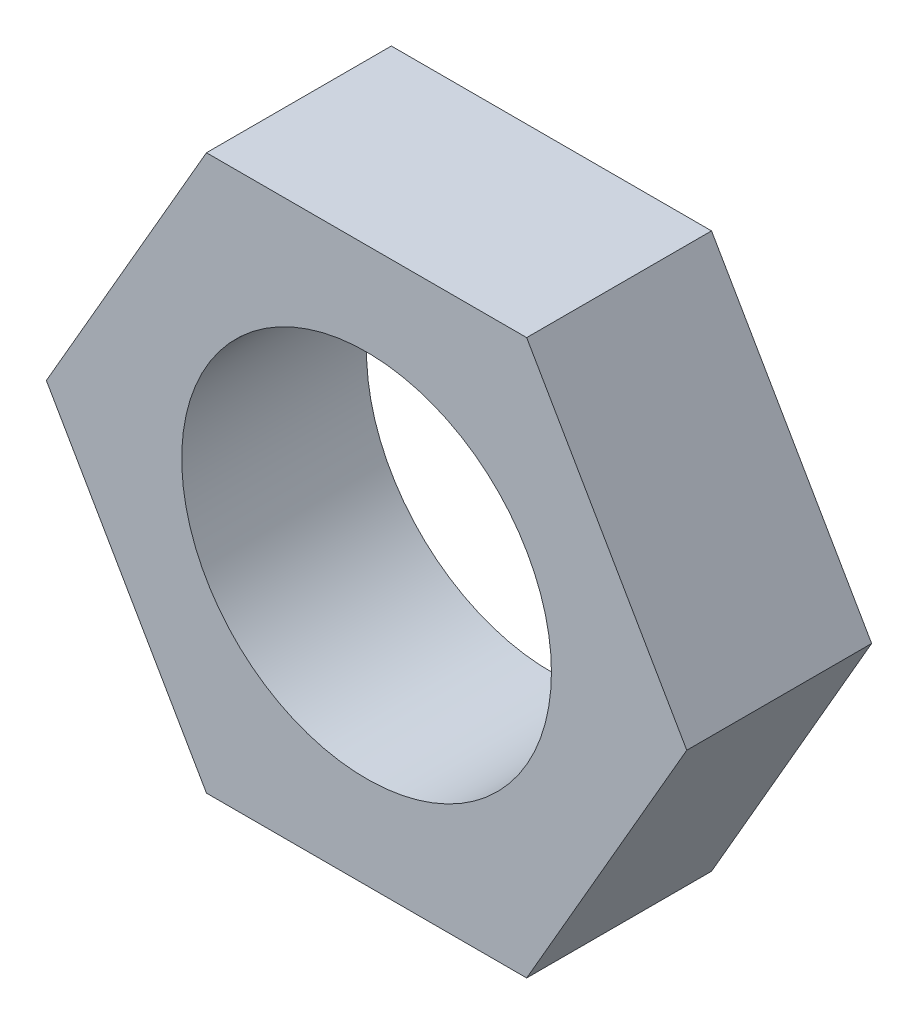
ISO-10303-21;
HEADER;
FILE_DESCRIPTION(('STEP AP214'),'2;1');
FILE_NAME('part.step','',(''),(''),'','','');
FILE_SCHEMA(('AUTOMOTIVE_DESIGN { 1 0 10303 214 1 1 1 1 }'));
ENDSEC;
DATA;
#1=APPLICATION_CONTEXT('core data for automotive mechanical design processes');
#2=APPLICATION_PROTOCOL_DEFINITION('international standard','automotive_design',2000,#1);
#3=PRODUCT_CONTEXT('',#1,'mechanical');
#4=PRODUCT('Part','Part','',(#3));
#5=PRODUCT_RELATED_PRODUCT_CATEGORY('part','',(#4));
#6=PRODUCT_DEFINITION_FORMATION('','',#4);
#7=PRODUCT_DEFINITION_CONTEXT('part definition',#1,'design');
#8=PRODUCT_DEFINITION('design','',#6,#7);
#9=PRODUCT_DEFINITION_SHAPE('','',#8);
#10=(LENGTH_UNIT() NAMED_UNIT(*) SI_UNIT(.MILLI.,.METRE.));
#11=(NAMED_UNIT(*) PLANE_ANGLE_UNIT() SI_UNIT($,.RADIAN.));
#12=(NAMED_UNIT(*) SI_UNIT($,.STERADIAN.) SOLID_ANGLE_UNIT());
#13=UNCERTAINTY_MEASURE_WITH_UNIT(LENGTH_MEASURE(1.E-05),#10,'distance_accuracy_value','');
#14=(GEOMETRIC_REPRESENTATION_CONTEXT(3) GLOBAL_UNCERTAINTY_ASSIGNED_CONTEXT((#13)) GLOBAL_UNIT_ASSIGNED_CONTEXT((#10,
#11,#12)) REPRESENTATION_CONTEXT('',''));
#15=CARTESIAN_POINT('',(0.,0.,0.));
#16=DIRECTION('',(0.,0.,1.));
#17=DIRECTION('',(1.,0.,0.));
#18=AXIS2_PLACEMENT_3D('',#15,#16,#17);
#19=CARTESIAN_POINT('',(0.,0.,2.));
#20=DIRECTION('',(0.,0.,1.));
#21=DIRECTION('',(1.,0.,0.));
#22=AXIS2_PLACEMENT_3D('',#19,#20,#21);
#23=PLANE('',#22);
#24=DIRECTION('',(0.5,0.866025403784438,0.));
#25=VECTOR('',#24,1.);
#26=CARTESIAN_POINT('',(1.73205080756888,-3.,2.));
#27=LINE('',#26,#25);
#28=CARTESIAN_POINT('',(1.73205080756888,-3.,2.));
#29=VERTEX_POINT('',#28);
#30=CARTESIAN_POINT('',(3.46410161513776,0.,2.));
#31=VERTEX_POINT('',#30);
#32=EDGE_CURVE('E128',#29,#31,#27,.T.);
#33=ORIENTED_EDGE('',*,*,#32,.T.);
#34=DIRECTION('',(-0.5,0.866025403784438,0.));
#35=VECTOR('',#34,1.);
#36=CARTESIAN_POINT('',(3.46410161513776,0.,2.));
#37=LINE('',#36,#35);
#38=CARTESIAN_POINT('',(1.73205080756888,3.,2.));
#39=VERTEX_POINT('',#38);
#40=EDGE_CURVE('E86',#31,#39,#37,.T.);
#41=ORIENTED_EDGE('',*,*,#40,.T.);
#42=DIRECTION('',(-1.,0.,0.));
#43=VECTOR('',#42,1.);
#44=CARTESIAN_POINT('',(1.73205080756888,3.,2.));
#45=LINE('',#44,#43);
#46=CARTESIAN_POINT('',(-1.73205080756888,3.,2.));
#47=VERTEX_POINT('',#46);
#48=EDGE_CURVE('E99',#39,#47,#45,.T.);
#49=ORIENTED_EDGE('',*,*,#48,.T.);
#50=DIRECTION('',(-0.5,-0.866025403784439,0.));
#51=VECTOR('',#50,1.);
#52=CARTESIAN_POINT('',(-1.73205080756888,3.,2.));
#53=LINE('',#52,#51);
#54=CARTESIAN_POINT('',(-3.46410161513775,0.,2.));
#55=VERTEX_POINT('',#54);
#56=EDGE_CURVE('E93',#47,#55,#53,.T.);
#57=ORIENTED_EDGE('',*,*,#56,.T.);
#58=DIRECTION('',(0.5,-0.866025403784438,0.));
#59=VECTOR('',#58,1.);
#60=CARTESIAN_POINT('',(-3.46410161513775,0.,2.));
#61=LINE('',#60,#59);
#62=CARTESIAN_POINT('',(-1.73205080756888,-3.,2.));
#63=VERTEX_POINT('',#62);
#64=EDGE_CURVE('E97',#55,#63,#61,.T.);
#65=ORIENTED_EDGE('',*,*,#64,.T.);
#66=DIRECTION('',(1.,0.,0.));
#67=VECTOR('',#66,1.);
#68=CARTESIAN_POINT('',(-1.73205080756888,-3.,2.));
#69=LINE('',#68,#67);
#70=EDGE_CURVE('E49',#63,#29,#69,.T.);
#71=ORIENTED_EDGE('',*,*,#70,.T.);
#72=EDGE_LOOP('',(#33,#41,#49,#57,#65,#71));
#73=FACE_BOUND('',#72,.T.);
#74=CARTESIAN_POINT('',(0.,0.,2.));
#75=DIRECTION('',(0.,0.,1.));
#76=DIRECTION('',(1.,0.,0.));
#77=AXIS2_PLACEMENT_3D('',#74,#75,#76);
#78=CIRCLE('',#77,2.);
#79=CARTESIAN_POINT('',(2.,0.,2.));
#80=VERTEX_POINT('',#79);
#81=EDGE_CURVE('E121',#80,#80,#78,.T.);
#82=ORIENTED_EDGE('',*,*,#81,.F.);
#83=EDGE_LOOP('',(#82));
#84=FACE_BOUND('',#83,.T.);
#85=ADVANCED_FACE('F32',(#73,#84),#23,.T.);
#86=CARTESIAN_POINT('',(0.,0.,0.));
#87=DIRECTION('',(0.,0.,1.));
#88=DIRECTION('',(1.,0.,0.));
#89=AXIS2_PLACEMENT_3D('',#86,#87,#88);
#90=PLANE('',#89);
#91=DIRECTION('',(0.5,0.866025403784438,0.));
#92=VECTOR('',#91,1.);
#93=CARTESIAN_POINT('',(1.73205080756888,-3.,0.));
#94=LINE('',#93,#92);
#95=CARTESIAN_POINT('',(1.73205080756888,-3.,0.));
#96=VERTEX_POINT('',#95);
#97=CARTESIAN_POINT('',(3.46410161513776,0.,0.));
#98=VERTEX_POINT('',#97);
#99=EDGE_CURVE('E117',#96,#98,#94,.T.);
#100=ORIENTED_EDGE('',*,*,#99,.F.);
#101=DIRECTION('',(1.,0.,0.));
#102=VECTOR('',#101,1.);
#103=CARTESIAN_POINT('',(-1.73205080756888,-3.,0.));
#104=LINE('',#103,#102);
#105=CARTESIAN_POINT('',(-1.73205080756888,-3.,0.));
#106=VERTEX_POINT('',#105);
#107=EDGE_CURVE('E78',#106,#96,#104,.T.);
#108=ORIENTED_EDGE('',*,*,#107,.F.);
#109=DIRECTION('',(0.5,-0.866025403784438,0.));
#110=VECTOR('',#109,1.);
#111=CARTESIAN_POINT('',(-3.46410161513775,0.,0.));
#112=LINE('',#111,#110);
#113=CARTESIAN_POINT('',(-3.46410161513775,0.,0.));
#114=VERTEX_POINT('',#113);
#115=EDGE_CURVE('E72',#114,#106,#112,.T.);
#116=ORIENTED_EDGE('',*,*,#115,.F.);
#117=DIRECTION('',(-0.5,-0.866025403784439,0.));
#118=VECTOR('',#117,1.);
#119=CARTESIAN_POINT('',(-1.73205080756888,3.,0.));
#120=LINE('',#119,#118);
#121=CARTESIAN_POINT('',(-1.73205080756888,3.,0.));
#122=VERTEX_POINT('',#121);
#123=EDGE_CURVE('E107',#122,#114,#120,.T.);
#124=ORIENTED_EDGE('',*,*,#123,.F.);
#125=DIRECTION('',(-1.,0.,0.));
#126=VECTOR('',#125,1.);
#127=CARTESIAN_POINT('',(1.73205080756888,3.,0.));
#128=LINE('',#127,#126);
#129=CARTESIAN_POINT('',(1.73205080756888,3.,0.));
#130=VERTEX_POINT('',#129);
#131=EDGE_CURVE('E123',#130,#122,#128,.T.);
#132=ORIENTED_EDGE('',*,*,#131,.F.);
#133=DIRECTION('',(-0.5,0.866025403784438,0.));
#134=VECTOR('',#133,1.);
#135=CARTESIAN_POINT('',(3.46410161513776,0.,0.));
#136=LINE('',#135,#134);
#137=EDGE_CURVE('E120',#98,#130,#136,.T.);
#138=ORIENTED_EDGE('',*,*,#137,.F.);
#139=EDGE_LOOP('',(#100,#108,#116,#124,#132,#138));
#140=FACE_BOUND('',#139,.T.);
#141=CARTESIAN_POINT('',(0.,0.,0.));
#142=DIRECTION('',(0.,0.,1.));
#143=DIRECTION('',(1.,0.,0.));
#144=AXIS2_PLACEMENT_3D('',#141,#142,#143);
#145=CIRCLE('',#144,2.);
#146=CARTESIAN_POINT('',(2.,0.,0.));
#147=VERTEX_POINT('',#146);
#148=EDGE_CURVE('E221',#147,#147,#145,.T.);
#149=ORIENTED_EDGE('',*,*,#148,.T.);
#150=EDGE_LOOP('',(#149));
#151=FACE_BOUND('',#150,.T.);
#152=ADVANCED_FACE('F137',(#140,#151),#90,.F.);
#153=CARTESIAN_POINT('',(1.73205080756888,-3.,2.));
#154=DIRECTION('',(-0.866025403784439,0.5,0.));
#155=DIRECTION('',(-0.5,-0.866025403784439,0.));
#156=AXIS2_PLACEMENT_3D('',#153,#154,#155);
#157=PLANE('',#156);
#158=ORIENTED_EDGE('',*,*,#99,.T.);
#159=DIRECTION('',(0.,0.,-1.));
#160=VECTOR('',#159,1.);
#161=CARTESIAN_POINT('',(3.46410161513776,0.,2.));
#162=LINE('',#161,#160);
#163=EDGE_CURVE('E11',#31,#98,#162,.T.);
#164=ORIENTED_EDGE('',*,*,#163,.F.);
#165=ORIENTED_EDGE('',*,*,#32,.F.);
#166=DIRECTION('',(0.,0.,-1.));
#167=VECTOR('',#166,1.);
#168=CARTESIAN_POINT('',(1.73205080756888,-3.,2.));
#169=LINE('',#168,#167);
#170=EDGE_CURVE('E113',#29,#96,#169,.T.);
#171=ORIENTED_EDGE('',*,*,#170,.T.);
#172=EDGE_LOOP('',(#158,#164,#165,#171));
#173=FACE_BOUND('',#172,.T.);
#174=ADVANCED_FACE('F34',(#173),#157,.F.);
#175=CARTESIAN_POINT('',(3.46410161513776,0.,2.));
#176=DIRECTION('',(-0.866025403784439,-0.5,0.));
#177=DIRECTION('',(0.5,-0.866025403784438,0.));
#178=AXIS2_PLACEMENT_3D('',#175,#176,#177);
#179=PLANE('',#178);
#180=ORIENTED_EDGE('',*,*,#137,.T.);
#181=DIRECTION('',(0.,0.,-1.));
#182=VECTOR('',#181,1.);
#183=CARTESIAN_POINT('',(1.73205080756888,3.,2.));
#184=LINE('',#183,#182);
#185=EDGE_CURVE('E41',#39,#130,#184,.T.);
#186=ORIENTED_EDGE('',*,*,#185,.F.);
#187=ORIENTED_EDGE('',*,*,#40,.F.);
#188=ORIENTED_EDGE('',*,*,#163,.T.);
#189=EDGE_LOOP('',(#180,#186,#187,#188));
#190=FACE_BOUND('',#189,.T.);
#191=ADVANCED_FACE('F162',(#190),#179,.F.);
#192=CARTESIAN_POINT('',(1.73205080756888,3.,2.));
#193=DIRECTION('',(0.,-1.,0.));
#194=DIRECTION('',(1.,0.,0.));
#195=AXIS2_PLACEMENT_3D('',#192,#193,#194);
#196=PLANE('',#195);
#197=ORIENTED_EDGE('',*,*,#131,.T.);
#198=DIRECTION('',(0.,0.,-1.));
#199=VECTOR('',#198,1.);
#200=CARTESIAN_POINT('',(-1.73205080756888,3.,2.));
#201=LINE('',#200,#199);
#202=EDGE_CURVE('E108',#47,#122,#201,.T.);
#203=ORIENTED_EDGE('',*,*,#202,.F.);
#204=ORIENTED_EDGE('',*,*,#48,.F.);
#205=ORIENTED_EDGE('',*,*,#185,.T.);
#206=EDGE_LOOP('',(#197,#203,#204,#205));
#207=FACE_BOUND('',#206,.T.);
#208=ADVANCED_FACE('F134',(#207),#196,.F.);
#209=CARTESIAN_POINT('',(-1.73205080756888,3.,2.));
#210=DIRECTION('',(0.866025403784439,-0.5,0.));
#211=DIRECTION('',(0.5,0.866025403784439,0.));
#212=AXIS2_PLACEMENT_3D('',#209,#210,#211);
#213=PLANE('',#212);
#214=ORIENTED_EDGE('',*,*,#123,.T.);
#215=DIRECTION('',(0.,0.,-1.));
#216=VECTOR('',#215,1.);
#217=CARTESIAN_POINT('',(-3.46410161513775,0.,2.));
#218=LINE('',#217,#216);
#219=EDGE_CURVE('E104',#55,#114,#218,.T.);
#220=ORIENTED_EDGE('',*,*,#219,.F.);
#221=ORIENTED_EDGE('',*,*,#56,.F.);
#222=ORIENTED_EDGE('',*,*,#202,.T.);
#223=EDGE_LOOP('',(#214,#220,#221,#222));
#224=FACE_BOUND('',#223,.T.);
#225=ADVANCED_FACE('F105',(#224),#213,.F.);
#226=CARTESIAN_POINT('',(-3.46410161513775,0.,2.));
#227=DIRECTION('',(0.866025403784438,0.5,0.));
#228=DIRECTION('',(-0.5,0.866025403784439,0.));
#229=AXIS2_PLACEMENT_3D('',#226,#227,#228);
#230=PLANE('',#229);
#231=ORIENTED_EDGE('',*,*,#115,.T.);
#232=DIRECTION('',(0.,0.,-1.));
#233=VECTOR('',#232,1.);
#234=CARTESIAN_POINT('',(-1.73205080756888,-3.,2.));
#235=LINE('',#234,#233);
#236=EDGE_CURVE('E109',#63,#106,#235,.T.);
#237=ORIENTED_EDGE('',*,*,#236,.F.);
#238=ORIENTED_EDGE('',*,*,#64,.F.);
#239=ORIENTED_EDGE('',*,*,#219,.T.);
#240=EDGE_LOOP('',(#231,#237,#238,#239));
#241=FACE_BOUND('',#240,.T.);
#242=ADVANCED_FACE('F111',(#241),#230,.F.);
#243=CARTESIAN_POINT('',(-1.73205080756888,-3.,2.));
#244=DIRECTION('',(0.,1.,0.));
#245=DIRECTION('',(0.,0.,1.));
#246=AXIS2_PLACEMENT_3D('',#243,#244,#245);
#247=PLANE('',#246);
#248=ORIENTED_EDGE('',*,*,#107,.T.);
#249=ORIENTED_EDGE('',*,*,#170,.F.);
#250=ORIENTED_EDGE('',*,*,#70,.F.);
#251=ORIENTED_EDGE('',*,*,#236,.T.);
#252=EDGE_LOOP('',(#248,#249,#250,#251));
#253=FACE_BOUND('',#252,.T.);
#254=ADVANCED_FACE('F142',(#253),#247,.F.);
#255=CARTESIAN_POINT('',(0.,0.,2.));
#256=DIRECTION('',(0.,0.,-1.));
#257=DIRECTION('',(-1.,0.,0.));
#258=AXIS2_PLACEMENT_3D('',#255,#256,#257);
#259=CYLINDRICAL_SURFACE('',#258,2.);
#260=ORIENTED_EDGE('',*,*,#81,.T.);
#261=EDGE_LOOP('',(#260));
#262=FACE_BOUND('',#261,.T.);
#263=ORIENTED_EDGE('',*,*,#148,.F.);
#264=EDGE_LOOP('',(#263));
#265=FACE_BOUND('',#264,.T.);
#266=ADVANCED_FACE('F144',(#262,#265),#259,.F.);
#267=CLOSED_SHELL('',(#85,#152,#174,#191,#208,#225,#242,#254,#266));
#268=MANIFOLD_SOLID_BREP('B2',#267);
#269=ADVANCED_BREP_SHAPE_REPRESENTATION('',(#18,#268),#14);
#270=SHAPE_DEFINITION_REPRESENTATION(#9,#269);
ENDSEC;
END-ISO-10303-21;
